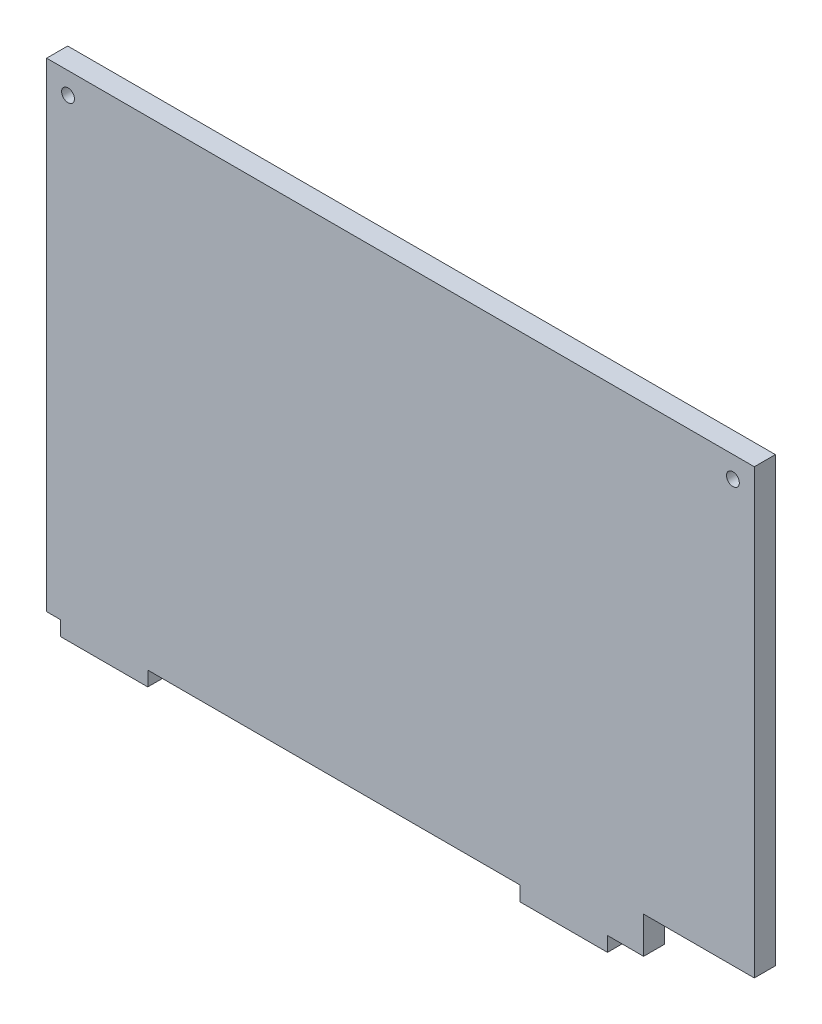
ISO-10303-21;
HEADER;
FILE_DESCRIPTION(('STEP AP214'),'2;1');
FILE_NAME('part.step','',(''),(''),'','','');
FILE_SCHEMA(('AUTOMOTIVE_DESIGN { 1 0 10303 214 1 1 1 1 }'));
ENDSEC;
DATA;
#1=APPLICATION_CONTEXT('core data for automotive mechanical design processes');
#2=APPLICATION_PROTOCOL_DEFINITION('international standard','automotive_design',2000,#1);
#3=PRODUCT_CONTEXT('',#1,'mechanical');
#4=PRODUCT('Part','Part','',(#3));
#5=PRODUCT_RELATED_PRODUCT_CATEGORY('part','',(#4));
#6=PRODUCT_DEFINITION_FORMATION('','',#4);
#7=PRODUCT_DEFINITION_CONTEXT('part definition',#1,'design');
#8=PRODUCT_DEFINITION('design','',#6,#7);
#9=PRODUCT_DEFINITION_SHAPE('','',#8);
#10=(LENGTH_UNIT() NAMED_UNIT(*) SI_UNIT(.MILLI.,.METRE.));
#11=(NAMED_UNIT(*) PLANE_ANGLE_UNIT() SI_UNIT($,.RADIAN.));
#12=(NAMED_UNIT(*) SI_UNIT($,.STERADIAN.) SOLID_ANGLE_UNIT());
#13=UNCERTAINTY_MEASURE_WITH_UNIT(LENGTH_MEASURE(1.E-05),#10,'distance_accuracy_value','');
#14=(GEOMETRIC_REPRESENTATION_CONTEXT(3) GLOBAL_UNCERTAINTY_ASSIGNED_CONTEXT((#13)) GLOBAL_UNIT_ASSIGNED_CONTEXT((#10,
#11,#12)) REPRESENTATION_CONTEXT('',''));
#15=CARTESIAN_POINT('',(0.,0.,0.));
#16=DIRECTION('',(0.,0.,1.));
#17=DIRECTION('',(1.,0.,0.));
#18=AXIS2_PLACEMENT_3D('',#15,#16,#17);
#19=CARTESIAN_POINT('',(6.3,0.,5.9));
#20=DIRECTION('',(1.,0.,0.));
#21=DIRECTION('',(0.,0.,-1.));
#22=AXIS2_PLACEMENT_3D('',#19,#20,#21);
#23=PLANE('',#22);
#24=DIRECTION('',(0.,-1.,0.));
#25=VECTOR('',#24,1.);
#26=CARTESIAN_POINT('',(6.3,0.,0.));
#27=LINE('',#26,#25);
#28=CARTESIAN_POINT('',(6.3,134.25,0.));
#29=VERTEX_POINT('',#28);
#30=CARTESIAN_POINT('',(6.3,0.,0.));
#31=VERTEX_POINT('',#30);
#32=EDGE_CURVE('E190',#29,#31,#27,.T.);
#33=ORIENTED_EDGE('',*,*,#32,.T.);
#34=DIRECTION('',(0.,0.,-1.));
#35=VECTOR('',#34,1.);
#36=CARTESIAN_POINT('',(6.3,0.,5.9));
#37=LINE('',#36,#35);
#38=CARTESIAN_POINT('',(6.3,0.,5.9));
#39=VERTEX_POINT('',#38);
#40=EDGE_CURVE('E12',#39,#31,#37,.T.);
#41=ORIENTED_EDGE('',*,*,#40,.F.);
#42=DIRECTION('',(0.,-1.,0.));
#43=VECTOR('',#42,1.);
#44=CARTESIAN_POINT('',(6.3,0.,5.9));
#45=LINE('',#44,#43);
#46=CARTESIAN_POINT('',(6.3,134.25,5.9));
#47=VERTEX_POINT('',#46);
#48=EDGE_CURVE('E212',#47,#39,#45,.T.);
#49=ORIENTED_EDGE('',*,*,#48,.F.);
#50=DIRECTION('',(0.,0.,-1.));
#51=VECTOR('',#50,1.);
#52=CARTESIAN_POINT('',(6.3,134.25,5.9));
#53=LINE('',#52,#51);
#54=EDGE_CURVE('E187',#47,#29,#53,.T.);
#55=ORIENTED_EDGE('',*,*,#54,.T.);
#56=EDGE_LOOP('',(#33,#41,#49,#55));
#57=FACE_BOUND('',#56,.T.);
#58=ADVANCED_FACE('F37',(#57),#23,.F.);
#59=CARTESIAN_POINT('',(0.,0.,5.9));
#60=DIRECTION('',(0.,1.,0.));
#61=DIRECTION('',(0.,0.,1.));
#62=AXIS2_PLACEMENT_3D('',#59,#60,#61);
#63=PLANE('',#62);
#64=DIRECTION('',(1.,0.,0.));
#65=VECTOR('',#64,1.);
#66=CARTESIAN_POINT('',(0.,0.,0.));
#67=LINE('',#66,#65);
#68=CARTESIAN_POINT('',(10.125,0.,0.));
#69=VERTEX_POINT('',#68);
#70=EDGE_CURVE('E188',#31,#69,#67,.T.);
#71=ORIENTED_EDGE('',*,*,#70,.T.);
#72=DIRECTION('',(0.,0.,-1.));
#73=VECTOR('',#72,1.);
#74=CARTESIAN_POINT('',(10.125,0.,5.9));
#75=LINE('',#74,#73);
#76=CARTESIAN_POINT('',(10.125,0.,5.9));
#77=VERTEX_POINT('',#76);
#78=EDGE_CURVE('E45',#77,#69,#75,.T.);
#79=ORIENTED_EDGE('',*,*,#78,.F.);
#80=DIRECTION('',(1.,0.,0.));
#81=VECTOR('',#80,1.);
#82=CARTESIAN_POINT('',(0.,0.,5.9));
#83=LINE('',#82,#81);
#84=EDGE_CURVE('E66',#39,#77,#83,.T.);
#85=ORIENTED_EDGE('',*,*,#84,.F.);
#86=ORIENTED_EDGE('',*,*,#40,.T.);
#87=EDGE_LOOP('',(#71,#79,#85,#86));
#88=FACE_BOUND('',#87,.T.);
#89=ADVANCED_FACE('F327',(#88),#63,.F.);
#90=CARTESIAN_POINT('',(10.125,0.,5.9));
#91=DIRECTION('',(1.,0.,0.));
#92=DIRECTION('',(0.,1.,0.));
#93=AXIS2_PLACEMENT_3D('',#90,#91,#92);
#94=PLANE('',#93);
#95=DIRECTION('',(0.,-1.,0.));
#96=VECTOR('',#95,1.);
#97=CARTESIAN_POINT('',(10.125,0.,0.));
#98=LINE('',#97,#96);
#99=CARTESIAN_POINT('',(10.125,-4.1,0.));
#100=VERTEX_POINT('',#99);
#101=EDGE_CURVE('E157',#69,#100,#98,.T.);
#102=ORIENTED_EDGE('',*,*,#101,.T.);
#103=DIRECTION('',(0.,0.,-1.));
#104=VECTOR('',#103,1.);
#105=CARTESIAN_POINT('',(10.125,-4.1,5.9));
#106=LINE('',#105,#104);
#107=CARTESIAN_POINT('',(10.125,-4.1,5.9));
#108=VERTEX_POINT('',#107);
#109=EDGE_CURVE('E154',#108,#100,#106,.T.);
#110=ORIENTED_EDGE('',*,*,#109,.F.);
#111=DIRECTION('',(0.,-1.,0.));
#112=VECTOR('',#111,1.);
#113=CARTESIAN_POINT('',(10.125,0.,5.9));
#114=LINE('',#113,#112);
#115=EDGE_CURVE('E144',#77,#108,#114,.T.);
#116=ORIENTED_EDGE('',*,*,#115,.F.);
#117=ORIENTED_EDGE('',*,*,#78,.T.);
#118=EDGE_LOOP('',(#102,#110,#116,#117));
#119=FACE_BOUND('',#118,.T.);
#120=ADVANCED_FACE('F155',(#119),#94,.F.);
#121=CARTESIAN_POINT('',(10.125,-4.1,5.9));
#122=DIRECTION('',(0.,1.,0.));
#123=DIRECTION('',(0.,0.,1.));
#124=AXIS2_PLACEMENT_3D('',#121,#122,#123);
#125=PLANE('',#124);
#126=DIRECTION('',(1.,0.,0.));
#127=VECTOR('',#126,1.);
#128=CARTESIAN_POINT('',(10.125,-4.1,0.));
#129=LINE('',#128,#127);
#130=CARTESIAN_POINT('',(34.625,-4.1,0.));
#131=VERTEX_POINT('',#130);
#132=EDGE_CURVE('E192',#100,#131,#129,.T.);
#133=ORIENTED_EDGE('',*,*,#132,.T.);
#134=DIRECTION('',(0.,0.,-1.));
#135=VECTOR('',#134,1.);
#136=CARTESIAN_POINT('',(34.625,-4.1,5.9));
#137=LINE('',#136,#135);
#138=CARTESIAN_POINT('',(34.625,-4.1,5.9));
#139=VERTEX_POINT('',#138);
#140=EDGE_CURVE('E160',#139,#131,#137,.T.);
#141=ORIENTED_EDGE('',*,*,#140,.F.);
#142=DIRECTION('',(1.,0.,0.));
#143=VECTOR('',#142,1.);
#144=CARTESIAN_POINT('',(10.125,-4.1,5.9));
#145=LINE('',#144,#143);
#146=EDGE_CURVE('E148',#108,#139,#145,.T.);
#147=ORIENTED_EDGE('',*,*,#146,.F.);
#148=ORIENTED_EDGE('',*,*,#109,.T.);
#149=EDGE_LOOP('',(#133,#141,#147,#148));
#150=FACE_BOUND('',#149,.T.);
#151=ADVANCED_FACE('F162',(#150),#125,.F.);
#152=CARTESIAN_POINT('',(34.625,-4.1,5.9));
#153=DIRECTION('',(-1.,0.,0.));
#154=DIRECTION('',(0.,0.,1.));
#155=AXIS2_PLACEMENT_3D('',#152,#153,#154);
#156=PLANE('',#155);
#157=DIRECTION('',(0.,1.,0.));
#158=VECTOR('',#157,1.);
#159=CARTESIAN_POINT('',(34.625,-4.1,0.));
#160=LINE('',#159,#158);
#161=CARTESIAN_POINT('',(34.625,0.,0.));
#162=VERTEX_POINT('',#161);
#163=EDGE_CURVE('E194',#131,#162,#160,.T.);
#164=ORIENTED_EDGE('',*,*,#163,.T.);
#165=DIRECTION('',(0.,0.,-1.));
#166=VECTOR('',#165,1.);
#167=CARTESIAN_POINT('',(34.625,0.,5.9));
#168=LINE('',#167,#166);
#169=CARTESIAN_POINT('',(34.625,0.,5.9));
#170=VERTEX_POINT('',#169);
#171=EDGE_CURVE('E235',#170,#162,#168,.T.);
#172=ORIENTED_EDGE('',*,*,#171,.F.);
#173=DIRECTION('',(0.,1.,0.));
#174=VECTOR('',#173,1.);
#175=CARTESIAN_POINT('',(34.625,-4.1,5.9));
#176=LINE('',#175,#174);
#177=EDGE_CURVE('E165',#139,#170,#176,.T.);
#178=ORIENTED_EDGE('',*,*,#177,.F.);
#179=ORIENTED_EDGE('',*,*,#140,.T.);
#180=EDGE_LOOP('',(#164,#172,#178,#179));
#181=FACE_BOUND('',#180,.T.);
#182=ADVANCED_FACE('F317',(#181),#156,.F.);
#183=CARTESIAN_POINT('',(34.625,0.,5.9));
#184=DIRECTION('',(0.,1.,0.));
#185=DIRECTION('',(0.,0.,1.));
#186=AXIS2_PLACEMENT_3D('',#183,#184,#185);
#187=PLANE('',#186);
#188=DIRECTION('',(1.,0.,0.));
#189=VECTOR('',#188,1.);
#190=CARTESIAN_POINT('',(34.625,0.,0.));
#191=LINE('',#190,#189);
#192=CARTESIAN_POINT('',(138.875,0.,0.));
#193=VERTEX_POINT('',#192);
#194=EDGE_CURVE('E196',#162,#193,#191,.T.);
#195=ORIENTED_EDGE('',*,*,#194,.T.);
#196=DIRECTION('',(0.,0.,-1.));
#197=VECTOR('',#196,1.);
#198=CARTESIAN_POINT('',(138.875,0.,5.9));
#199=LINE('',#198,#197);
#200=CARTESIAN_POINT('',(138.875,0.,5.9));
#201=VERTEX_POINT('',#200);
#202=EDGE_CURVE('E232',#201,#193,#199,.T.);
#203=ORIENTED_EDGE('',*,*,#202,.F.);
#204=DIRECTION('',(1.,0.,0.));
#205=VECTOR('',#204,1.);
#206=CARTESIAN_POINT('',(34.625,0.,5.9));
#207=LINE('',#206,#205);
#208=EDGE_CURVE('E167',#170,#201,#207,.T.);
#209=ORIENTED_EDGE('',*,*,#208,.F.);
#210=ORIENTED_EDGE('',*,*,#171,.T.);
#211=EDGE_LOOP('',(#195,#203,#209,#210));
#212=FACE_BOUND('',#211,.T.);
#213=ADVANCED_FACE('F313',(#212),#187,.F.);
#214=CARTESIAN_POINT('',(138.875,0.,5.9));
#215=DIRECTION('',(1.,0.,0.));
#216=DIRECTION('',(0.,0.,-1.));
#217=AXIS2_PLACEMENT_3D('',#214,#215,#216);
#218=PLANE('',#217);
#219=DIRECTION('',(0.,-1.,0.));
#220=VECTOR('',#219,1.);
#221=CARTESIAN_POINT('',(138.875,0.,0.));
#222=LINE('',#221,#220);
#223=CARTESIAN_POINT('',(138.875,-4.1,0.));
#224=VERTEX_POINT('',#223);
#225=EDGE_CURVE('E198',#193,#224,#222,.T.);
#226=ORIENTED_EDGE('',*,*,#225,.T.);
#227=DIRECTION('',(0.,0.,-1.));
#228=VECTOR('',#227,1.);
#229=CARTESIAN_POINT('',(138.875,-4.1,5.9));
#230=LINE('',#229,#228);
#231=CARTESIAN_POINT('',(138.875,-4.1,5.9));
#232=VERTEX_POINT('',#231);
#233=EDGE_CURVE('E229',#232,#224,#230,.T.);
#234=ORIENTED_EDGE('',*,*,#233,.F.);
#235=DIRECTION('',(0.,-1.,0.));
#236=VECTOR('',#235,1.);
#237=CARTESIAN_POINT('',(138.875,0.,5.9));
#238=LINE('',#237,#236);
#239=EDGE_CURVE('E172',#201,#232,#238,.T.);
#240=ORIENTED_EDGE('',*,*,#239,.F.);
#241=ORIENTED_EDGE('',*,*,#202,.T.);
#242=EDGE_LOOP('',(#226,#234,#240,#241));
#243=FACE_BOUND('',#242,.T.);
#244=ADVANCED_FACE('F309',(#243),#218,.F.);
#245=CARTESIAN_POINT('',(138.875,-4.1,5.9));
#246=DIRECTION('',(0.,1.,0.));
#247=DIRECTION('',(0.,0.,1.));
#248=AXIS2_PLACEMENT_3D('',#245,#246,#247);
#249=PLANE('',#248);
#250=DIRECTION('',(1.,0.,0.));
#251=VECTOR('',#250,1.);
#252=CARTESIAN_POINT('',(138.875,-4.1,0.));
#253=LINE('',#252,#251);
#254=CARTESIAN_POINT('',(163.375,-4.1,0.));
#255=VERTEX_POINT('',#254);
#256=EDGE_CURVE('E200',#224,#255,#253,.T.);
#257=ORIENTED_EDGE('',*,*,#256,.T.);
#258=DIRECTION('',(0.,0.,-1.));
#259=VECTOR('',#258,1.);
#260=CARTESIAN_POINT('',(163.375,-4.1,5.9));
#261=LINE('',#260,#259);
#262=CARTESIAN_POINT('',(163.375,-4.1,5.9));
#263=VERTEX_POINT('',#262);
#264=EDGE_CURVE('E226',#263,#255,#261,.T.);
#265=ORIENTED_EDGE('',*,*,#264,.F.);
#266=DIRECTION('',(1.,0.,0.));
#267=VECTOR('',#266,1.);
#268=CARTESIAN_POINT('',(138.875,-4.1,5.9));
#269=LINE('',#268,#267);
#270=EDGE_CURVE('E174',#232,#263,#269,.T.);
#271=ORIENTED_EDGE('',*,*,#270,.F.);
#272=ORIENTED_EDGE('',*,*,#233,.T.);
#273=EDGE_LOOP('',(#257,#265,#271,#272));
#274=FACE_BOUND('',#273,.T.);
#275=ADVANCED_FACE('F304',(#274),#249,.F.);
#276=CARTESIAN_POINT('',(163.375,-4.1,5.9));
#277=DIRECTION('',(-1.,0.,0.));
#278=DIRECTION('',(0.,0.,1.));
#279=AXIS2_PLACEMENT_3D('',#276,#277,#278);
#280=PLANE('',#279);
#281=DIRECTION('',(0.,1.,0.));
#282=VECTOR('',#281,1.);
#283=CARTESIAN_POINT('',(163.375,-4.1,0.));
#284=LINE('',#283,#282);
#285=CARTESIAN_POINT('',(163.375,0.,0.));
#286=VERTEX_POINT('',#285);
#287=EDGE_CURVE('E202',#255,#286,#284,.T.);
#288=ORIENTED_EDGE('',*,*,#287,.T.);
#289=DIRECTION('',(0.,0.,-1.));
#290=VECTOR('',#289,1.);
#291=CARTESIAN_POINT('',(163.375,0.,5.9));
#292=LINE('',#291,#290);
#293=CARTESIAN_POINT('',(163.375,0.,5.9));
#294=VERTEX_POINT('',#293);
#295=EDGE_CURVE('E223',#294,#286,#292,.T.);
#296=ORIENTED_EDGE('',*,*,#295,.F.);
#297=DIRECTION('',(0.,1.,0.));
#298=VECTOR('',#297,1.);
#299=CARTESIAN_POINT('',(163.375,-4.1,5.9));
#300=LINE('',#299,#298);
#301=EDGE_CURVE('E176',#263,#294,#300,.T.);
#302=ORIENTED_EDGE('',*,*,#301,.F.);
#303=ORIENTED_EDGE('',*,*,#264,.T.);
#304=EDGE_LOOP('',(#288,#296,#302,#303));
#305=FACE_BOUND('',#304,.T.);
#306=ADVANCED_FACE('F298',(#305),#280,.F.);
#307=CARTESIAN_POINT('',(163.375,0.,5.9));
#308=DIRECTION('',(0.,1.,0.));
#309=DIRECTION('',(0.,0.,1.));
#310=AXIS2_PLACEMENT_3D('',#307,#308,#309);
#311=PLANE('',#310);
#312=DIRECTION('',(1.,0.,0.));
#313=VECTOR('',#312,1.);
#314=CARTESIAN_POINT('',(163.375,0.,0.));
#315=LINE('',#314,#313);
#316=CARTESIAN_POINT('',(173.5,0.,0.));
#317=VERTEX_POINT('',#316);
#318=EDGE_CURVE('E204',#286,#317,#315,.T.);
#319=ORIENTED_EDGE('',*,*,#318,.T.);
#320=DIRECTION('',(0.,0.,-1.));
#321=VECTOR('',#320,1.);
#322=CARTESIAN_POINT('',(173.5,0.,5.9));
#323=LINE('',#322,#321);
#324=CARTESIAN_POINT('',(173.5,0.,5.9));
#325=VERTEX_POINT('',#324);
#326=EDGE_CURVE('E220',#325,#317,#323,.T.);
#327=ORIENTED_EDGE('',*,*,#326,.F.);
#328=DIRECTION('',(1.,0.,0.));
#329=VECTOR('',#328,1.);
#330=CARTESIAN_POINT('',(163.375,0.,5.9));
#331=LINE('',#330,#329);
#332=EDGE_CURVE('E178',#294,#325,#331,.T.);
#333=ORIENTED_EDGE('',*,*,#332,.F.);
#334=ORIENTED_EDGE('',*,*,#295,.T.);
#335=EDGE_LOOP('',(#319,#327,#333,#334));
#336=FACE_BOUND('',#335,.T.);
#337=ADVANCED_FACE('F294',(#336),#311,.F.);
#338=CARTESIAN_POINT('',(173.5,0.,5.9));
#339=DIRECTION('',(-1.,0.,0.));
#340=DIRECTION('',(0.,0.,1.));
#341=AXIS2_PLACEMENT_3D('',#338,#339,#340);
#342=PLANE('',#341);
#343=DIRECTION('',(0.,1.,0.));
#344=VECTOR('',#343,1.);
#345=CARTESIAN_POINT('',(173.5,0.,0.));
#346=LINE('',#345,#344);
#347=CARTESIAN_POINT('',(173.5,10.25,0.));
#348=VERTEX_POINT('',#347);
#349=EDGE_CURVE('E206',#317,#348,#346,.T.);
#350=ORIENTED_EDGE('',*,*,#349,.T.);
#351=DIRECTION('',(0.,0.,-1.));
#352=VECTOR('',#351,1.);
#353=CARTESIAN_POINT('',(173.5,10.25,5.9));
#354=LINE('',#353,#352);
#355=CARTESIAN_POINT('',(173.5,10.25,5.9));
#356=VERTEX_POINT('',#355);
#357=EDGE_CURVE('E217',#356,#348,#354,.T.);
#358=ORIENTED_EDGE('',*,*,#357,.F.);
#359=DIRECTION('',(0.,1.,0.));
#360=VECTOR('',#359,1.);
#361=CARTESIAN_POINT('',(173.5,0.,5.9));
#362=LINE('',#361,#360);
#363=EDGE_CURVE('E180',#325,#356,#362,.T.);
#364=ORIENTED_EDGE('',*,*,#363,.F.);
#365=ORIENTED_EDGE('',*,*,#326,.T.);
#366=EDGE_LOOP('',(#350,#358,#364,#365));
#367=FACE_BOUND('',#366,.T.);
#368=ADVANCED_FACE('F290',(#367),#342,.F.);
#369=CARTESIAN_POINT('',(173.5,10.25,5.9));
#370=DIRECTION('',(0.,1.,0.));
#371=DIRECTION('',(0.,0.,1.));
#372=AXIS2_PLACEMENT_3D('',#369,#370,#371);
#373=PLANE('',#372);
#374=DIRECTION('',(1.,0.,0.));
#375=VECTOR('',#374,1.);
#376=CARTESIAN_POINT('',(173.5,10.25,0.));
#377=LINE('',#376,#375);
#378=CARTESIAN_POINT('',(204.5,10.25,0.));
#379=VERTEX_POINT('',#378);
#380=EDGE_CURVE('E208',#348,#379,#377,.T.);
#381=ORIENTED_EDGE('',*,*,#380,.T.);
#382=DIRECTION('',(0.,0.,-1.));
#383=VECTOR('',#382,1.);
#384=CARTESIAN_POINT('',(204.5,10.25,5.9));
#385=LINE('',#384,#383);
#386=CARTESIAN_POINT('',(204.5,10.25,5.9));
#387=VERTEX_POINT('',#386);
#388=EDGE_CURVE('E215',#387,#379,#385,.T.);
#389=ORIENTED_EDGE('',*,*,#388,.F.);
#390=DIRECTION('',(1.,0.,0.));
#391=VECTOR('',#390,1.);
#392=CARTESIAN_POINT('',(173.5,10.25,5.9));
#393=LINE('',#392,#391);
#394=EDGE_CURVE('E182',#356,#387,#393,.T.);
#395=ORIENTED_EDGE('',*,*,#394,.F.);
#396=ORIENTED_EDGE('',*,*,#357,.T.);
#397=EDGE_LOOP('',(#381,#389,#395,#396));
#398=FACE_BOUND('',#397,.T.);
#399=ADVANCED_FACE('F284',(#398),#373,.F.);
#400=CARTESIAN_POINT('',(204.5,134.25,5.9));
#401=DIRECTION('',(-1.,0.,0.));
#402=DIRECTION('',(0.,-1.,0.));
#403=AXIS2_PLACEMENT_3D('',#400,#401,#402);
#404=PLANE('',#403);
#405=DIRECTION('',(0.,1.,0.));
#406=VECTOR('',#405,1.);
#407=CARTESIAN_POINT('',(204.5,134.25,0.));
#408=LINE('',#407,#406);
#409=CARTESIAN_POINT('',(204.5,134.25,0.));
#410=VERTEX_POINT('',#409);
#411=EDGE_CURVE('E82',#379,#410,#408,.T.);
#412=ORIENTED_EDGE('',*,*,#411,.T.);
#413=DIRECTION('',(0.,0.,-1.));
#414=VECTOR('',#413,1.);
#415=CARTESIAN_POINT('',(204.5,134.25,5.9));
#416=LINE('',#415,#414);
#417=CARTESIAN_POINT('',(204.5,134.25,5.9));
#418=VERTEX_POINT('',#417);
#419=EDGE_CURVE('E213',#418,#410,#416,.T.);
#420=ORIENTED_EDGE('',*,*,#419,.F.);
#421=DIRECTION('',(0.,1.,0.));
#422=VECTOR('',#421,1.);
#423=CARTESIAN_POINT('',(204.5,134.25,5.9));
#424=LINE('',#423,#422);
#425=EDGE_CURVE('E184',#387,#418,#424,.T.);
#426=ORIENTED_EDGE('',*,*,#425,.F.);
#427=ORIENTED_EDGE('',*,*,#388,.T.);
#428=EDGE_LOOP('',(#412,#420,#426,#427));
#429=FACE_BOUND('',#428,.T.);
#430=ADVANCED_FACE('F278',(#429),#404,.F.);
#431=CARTESIAN_POINT('',(0.,134.25,5.9));
#432=DIRECTION('',(0.,-1.,0.));
#433=DIRECTION('',(0.,0.,-1.));
#434=AXIS2_PLACEMENT_3D('',#431,#432,#433);
#435=PLANE('',#434);
#436=DIRECTION('',(-1.,0.,0.));
#437=VECTOR('',#436,1.);
#438=CARTESIAN_POINT('',(0.,134.25,0.));
#439=LINE('',#438,#437);
#440=EDGE_CURVE('E74',#410,#29,#439,.T.);
#441=ORIENTED_EDGE('',*,*,#440,.T.);
#442=ORIENTED_EDGE('',*,*,#54,.F.);
#443=DIRECTION('',(-1.,0.,0.));
#444=VECTOR('',#443,1.);
#445=CARTESIAN_POINT('',(0.,134.25,5.9));
#446=LINE('',#445,#444);
#447=EDGE_CURVE('E53',#418,#47,#446,.T.);
#448=ORIENTED_EDGE('',*,*,#447,.F.);
#449=ORIENTED_EDGE('',*,*,#419,.T.);
#450=EDGE_LOOP('',(#441,#442,#448,#449));
#451=FACE_BOUND('',#450,.T.);
#452=ADVANCED_FACE('F276',(#451),#435,.F.);
#453=CARTESIAN_POINT('',(0.,0.,5.9));
#454=DIRECTION('',(0.,0.,-1.));
#455=DIRECTION('',(-1.,0.,0.));
#456=AXIS2_PLACEMENT_3D('',#453,#454,#455);
#457=PLANE('',#456);
#458=CARTESIAN_POINT('',(198.5,128.25,5.9));
#459=DIRECTION('',(0.,0.,-1.));
#460=DIRECTION('',(-1.,0.,0.));
#461=AXIS2_PLACEMENT_3D('',#458,#459,#460);
#462=CIRCLE('',#461,1.8);
#463=CARTESIAN_POINT('',(196.7,128.25,5.9));
#464=VERTEX_POINT('',#463);
#465=EDGE_CURVE('E254',#464,#464,#462,.T.);
#466=ORIENTED_EDGE('',*,*,#465,.T.);
#467=EDGE_LOOP('',(#466));
#468=FACE_BOUND('',#467,.T.);
#469=CARTESIAN_POINT('',(12.2999999999999,128.25,5.9));
#470=DIRECTION('',(0.,0.,-1.));
#471=DIRECTION('',(-1.,0.,0.));
#472=AXIS2_PLACEMENT_3D('',#469,#470,#471);
#473=CIRCLE('',#472,1.8);
#474=CARTESIAN_POINT('',(10.4999999999999,128.25,5.9));
#475=VERTEX_POINT('',#474);
#476=EDGE_CURVE('E242',#475,#475,#473,.T.);
#477=ORIENTED_EDGE('',*,*,#476,.T.);
#478=EDGE_LOOP('',(#477));
#479=FACE_BOUND('',#478,.T.);
#480=ORIENTED_EDGE('',*,*,#48,.T.);
#481=ORIENTED_EDGE('',*,*,#84,.T.);
#482=ORIENTED_EDGE('',*,*,#115,.T.);
#483=ORIENTED_EDGE('',*,*,#146,.T.);
#484=ORIENTED_EDGE('',*,*,#177,.T.);
#485=ORIENTED_EDGE('',*,*,#208,.T.);
#486=ORIENTED_EDGE('',*,*,#239,.T.);
#487=ORIENTED_EDGE('',*,*,#270,.T.);
#488=ORIENTED_EDGE('',*,*,#301,.T.);
#489=ORIENTED_EDGE('',*,*,#332,.T.);
#490=ORIENTED_EDGE('',*,*,#363,.T.);
#491=ORIENTED_EDGE('',*,*,#394,.T.);
#492=ORIENTED_EDGE('',*,*,#425,.T.);
#493=ORIENTED_EDGE('',*,*,#447,.T.);
#494=EDGE_LOOP('',(#480,#481,#482,#483,#484,#485,#486,#487,#488,#489,#490,#491,#492,#493));
#495=FACE_BOUND('',#494,.T.);
#496=ADVANCED_FACE('F146',(#468,#479,#495),#457,.F.);
#497=CARTESIAN_POINT('',(0.,0.,0.));
#498=DIRECTION('',(0.,0.,-1.));
#499=DIRECTION('',(-1.,0.,0.));
#500=AXIS2_PLACEMENT_3D('',#497,#498,#499);
#501=PLANE('',#500);
#502=CARTESIAN_POINT('',(198.5,128.25,0.));
#503=DIRECTION('',(0.,0.,-1.));
#504=DIRECTION('',(-1.,0.,0.));
#505=AXIS2_PLACEMENT_3D('',#502,#503,#504);
#506=CIRCLE('',#505,3.14999999999999);
#507=CARTESIAN_POINT('',(195.35,128.25,0.));
#508=VERTEX_POINT('',#507);
#509=EDGE_CURVE('E260',#508,#508,#506,.T.);
#510=ORIENTED_EDGE('',*,*,#509,.F.);
#511=EDGE_LOOP('',(#510));
#512=FACE_BOUND('',#511,.T.);
#513=CARTESIAN_POINT('',(12.2999999999999,128.25,0.));
#514=DIRECTION('',(0.,0.,-1.));
#515=DIRECTION('',(-1.,0.,0.));
#516=AXIS2_PLACEMENT_3D('',#513,#514,#515);
#517=CIRCLE('',#516,3.15);
#518=CARTESIAN_POINT('',(9.14999999999994,128.25,0.));
#519=VERTEX_POINT('',#518);
#520=EDGE_CURVE('E251',#519,#519,#517,.T.);
#521=ORIENTED_EDGE('',*,*,#520,.F.);
#522=EDGE_LOOP('',(#521));
#523=FACE_BOUND('',#522,.T.);
#524=ORIENTED_EDGE('',*,*,#32,.F.);
#525=ORIENTED_EDGE('',*,*,#440,.F.);
#526=ORIENTED_EDGE('',*,*,#411,.F.);
#527=ORIENTED_EDGE('',*,*,#380,.F.);
#528=ORIENTED_EDGE('',*,*,#349,.F.);
#529=ORIENTED_EDGE('',*,*,#318,.F.);
#530=ORIENTED_EDGE('',*,*,#287,.F.);
#531=ORIENTED_EDGE('',*,*,#256,.F.);
#532=ORIENTED_EDGE('',*,*,#225,.F.);
#533=ORIENTED_EDGE('',*,*,#194,.F.);
#534=ORIENTED_EDGE('',*,*,#163,.F.);
#535=ORIENTED_EDGE('',*,*,#132,.F.);
#536=ORIENTED_EDGE('',*,*,#101,.F.);
#537=ORIENTED_EDGE('',*,*,#70,.F.);
#538=EDGE_LOOP('',(#524,#525,#526,#527,#528,#529,#530,#531,#532,#533,#534,#535,#536,#537));
#539=FACE_BOUND('',#538,.T.);
#540=ADVANCED_FACE('F266',(#512,#523,#539),#501,.T.);
#541=CARTESIAN_POINT('',(12.2999999999999,128.25,0.));
#542=DIRECTION('',(0.,0.,-1.));
#543=DIRECTION('',(-1.,0.,0.));
#544=AXIS2_PLACEMENT_3D('',#541,#542,#543);
#545=CYLINDRICAL_SURFACE('',#544,1.8);
#546=ORIENTED_EDGE('',*,*,#476,.F.);
#547=EDGE_LOOP('',(#546));
#548=FACE_BOUND('',#547,.T.);
#549=CARTESIAN_POINT('',(12.2999999999999,128.25,1.35));
#550=DIRECTION('',(0.,0.,-1.));
#551=DIRECTION('',(-1.,0.,0.));
#552=AXIS2_PLACEMENT_3D('',#549,#550,#551);
#553=CIRCLE('',#552,1.8);
#554=CARTESIAN_POINT('',(10.4999999999999,128.25,1.35));
#555=VERTEX_POINT('',#554);
#556=EDGE_CURVE('E248',#555,#555,#553,.T.);
#557=ORIENTED_EDGE('',*,*,#556,.T.);
#558=EDGE_LOOP('',(#557));
#559=FACE_BOUND('',#558,.T.);
#560=ADVANCED_FACE('F269',(#548,#559),#545,.F.);
#561=CARTESIAN_POINT('',(12.2999999999999,128.25,0.));
#562=DIRECTION('',(0.,0.,-1.));
#563=DIRECTION('',(-1.,0.,0.));
#564=AXIS2_PLACEMENT_3D('',#561,#562,#563);
#565=CONICAL_SURFACE('',#564,3.15,0.785398163397448);
#566=ORIENTED_EDGE('',*,*,#556,.F.);
#567=EDGE_LOOP('',(#566));
#568=FACE_BOUND('',#567,.T.);
#569=ORIENTED_EDGE('',*,*,#520,.T.);
#570=EDGE_LOOP('',(#569));
#571=FACE_BOUND('',#570,.T.);
#572=ADVANCED_FACE('F447',(#568,#571),#565,.F.);
#573=CARTESIAN_POINT('',(198.5,128.25,0.));
#574=DIRECTION('',(0.,0.,-1.));
#575=DIRECTION('',(-1.,0.,0.));
#576=AXIS2_PLACEMENT_3D('',#573,#574,#575);
#577=CYLINDRICAL_SURFACE('',#576,1.8);
#578=ORIENTED_EDGE('',*,*,#465,.F.);
#579=EDGE_LOOP('',(#578));
#580=FACE_BOUND('',#579,.T.);
#581=CARTESIAN_POINT('',(198.5,128.25,1.35));
#582=DIRECTION('',(0.,0.,-1.));
#583=DIRECTION('',(-1.,0.,0.));
#584=AXIS2_PLACEMENT_3D('',#581,#582,#583);
#585=CIRCLE('',#584,1.8);
#586=CARTESIAN_POINT('',(196.7,128.25,1.35));
#587=VERTEX_POINT('',#586);
#588=EDGE_CURVE('E257',#587,#587,#585,.T.);
#589=ORIENTED_EDGE('',*,*,#588,.T.);
#590=EDGE_LOOP('',(#589));
#591=FACE_BOUND('',#590,.T.);
#592=ADVANCED_FACE('F457',(#580,#591),#577,.F.);
#593=CARTESIAN_POINT('',(198.5,128.25,0.));
#594=DIRECTION('',(0.,0.,-1.));
#595=DIRECTION('',(-1.,0.,0.));
#596=AXIS2_PLACEMENT_3D('',#593,#594,#595);
#597=CONICAL_SURFACE('',#596,3.14999999999999,0.785398163397445);
#598=ORIENTED_EDGE('',*,*,#588,.F.);
#599=EDGE_LOOP('',(#598));
#600=FACE_BOUND('',#599,.T.);
#601=ORIENTED_EDGE('',*,*,#509,.T.);
#602=EDGE_LOOP('',(#601));
#603=FACE_BOUND('',#602,.T.);
#604=ADVANCED_FACE('F264',(#600,#603),#597,.F.);
#605=CLOSED_SHELL('',(#58,#89,#120,#151,#182,#213,#244,#275,#306,#337,#368,#399,#430,#452,#496,
#540,#560,#572,#592,#604));
#606=MANIFOLD_SOLID_BREP('B2',#605);
#607=ADVANCED_BREP_SHAPE_REPRESENTATION('',(#18,#606),#14);
#608=SHAPE_DEFINITION_REPRESENTATION(#9,#607);
ENDSEC;
END-ISO-10303-21;
